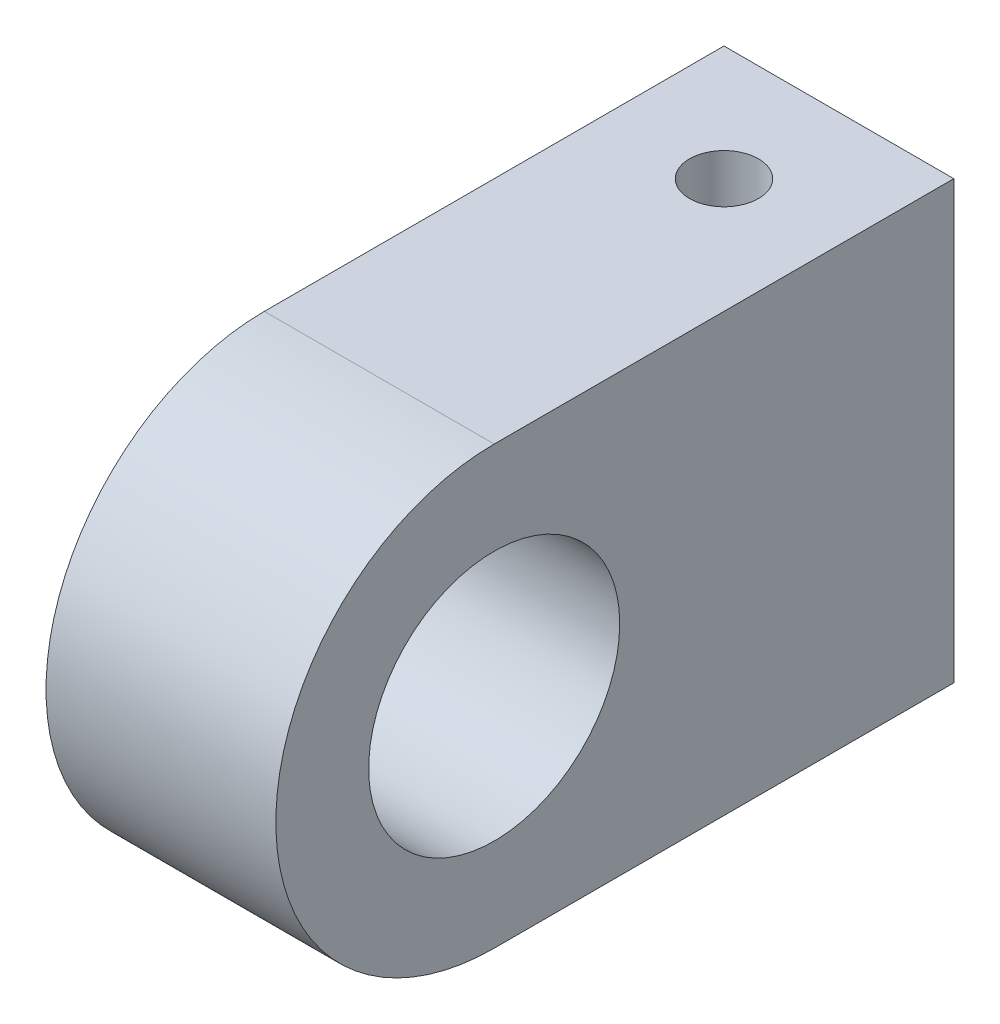
ISO-10303-21;
HEADER;
FILE_DESCRIPTION(('STEP AP214'),'2;1');
FILE_NAME('part.step','',(''),(''),'','','');
FILE_SCHEMA(('AUTOMOTIVE_DESIGN { 1 0 10303 214 1 1 1 1 }'));
ENDSEC;
DATA;
#1=APPLICATION_CONTEXT('core data for automotive mechanical design processes');
#2=APPLICATION_PROTOCOL_DEFINITION('international standard','automotive_design',2000,#1);
#3=PRODUCT_CONTEXT('',#1,'mechanical');
#4=PRODUCT('Part','Part','',(#3));
#5=PRODUCT_RELATED_PRODUCT_CATEGORY('part','',(#4));
#6=PRODUCT_DEFINITION_FORMATION('','',#4);
#7=PRODUCT_DEFINITION_CONTEXT('part definition',#1,'design');
#8=PRODUCT_DEFINITION('design','',#6,#7);
#9=PRODUCT_DEFINITION_SHAPE('','',#8);
#10=(LENGTH_UNIT() NAMED_UNIT(*) SI_UNIT(.MILLI.,.METRE.));
#11=(NAMED_UNIT(*) PLANE_ANGLE_UNIT() SI_UNIT($,.RADIAN.));
#12=(NAMED_UNIT(*) SI_UNIT($,.STERADIAN.) SOLID_ANGLE_UNIT());
#13=UNCERTAINTY_MEASURE_WITH_UNIT(LENGTH_MEASURE(1.E-05),#10,'distance_accuracy_value','');
#14=(GEOMETRIC_REPRESENTATION_CONTEXT(3) GLOBAL_UNCERTAINTY_ASSIGNED_CONTEXT((#13)) GLOBAL_UNIT_ASSIGNED_CONTEXT((#10,
#11,#12)) REPRESENTATION_CONTEXT('',''));
#15=CARTESIAN_POINT('',(0.,0.,0.));
#16=DIRECTION('',(0.,0.,1.));
#17=DIRECTION('',(1.,0.,0.));
#18=AXIS2_PLACEMENT_3D('',#15,#16,#17);
#19=CARTESIAN_POINT('',(10.,0.,0.));
#20=DIRECTION('',(1.,0.,0.));
#21=DIRECTION('',(0.,0.,-1.));
#22=AXIS2_PLACEMENT_3D('',#19,#20,#21);
#23=PLANE('',#22);
#24=CARTESIAN_POINT('',(10.,0.,0.));
#25=DIRECTION('',(1.,0.,0.));
#26=DIRECTION('',(0.,0.,-1.));
#27=AXIS2_PLACEMENT_3D('',#24,#25,#26);
#28=CIRCLE('',#27,9.5);
#29=CARTESIAN_POINT('',(10.,9.5,0.));
#30=VERTEX_POINT('',#29);
#31=CARTESIAN_POINT('',(10.,-9.5,0.));
#32=VERTEX_POINT('',#31);
#33=EDGE_CURVE('E51',#30,#32,#28,.T.);
#34=ORIENTED_EDGE('',*,*,#33,.T.);
#35=DIRECTION('',(0.,0.,-1.));
#36=VECTOR('',#35,1.);
#37=CARTESIAN_POINT('',(10.,-9.5,-20.));
#38=LINE('',#37,#36);
#39=CARTESIAN_POINT('',(10.,-9.5,-20.));
#40=VERTEX_POINT('',#39);
#41=EDGE_CURVE('E82',#32,#40,#38,.T.);
#42=ORIENTED_EDGE('',*,*,#41,.T.);
#43=DIRECTION('',(0.,1.,0.));
#44=VECTOR('',#43,1.);
#45=CARTESIAN_POINT('',(10.,9.5,-20.));
#46=LINE('',#45,#44);
#47=CARTESIAN_POINT('',(10.,9.5,-20.));
#48=VERTEX_POINT('',#47);
#49=EDGE_CURVE('E86',#40,#48,#46,.T.);
#50=ORIENTED_EDGE('',*,*,#49,.T.);
#51=DIRECTION('',(0.,0.,1.));
#52=VECTOR('',#51,1.);
#53=CARTESIAN_POINT('',(10.,9.5,0.));
#54=LINE('',#53,#52);
#55=EDGE_CURVE('E93',#48,#30,#54,.T.);
#56=ORIENTED_EDGE('',*,*,#55,.T.);
#57=EDGE_LOOP('',(#34,#42,#50,#56));
#58=FACE_BOUND('',#57,.T.);
#59=CARTESIAN_POINT('',(10.,0.,0.));
#60=DIRECTION('',(1.,0.,0.));
#61=DIRECTION('',(0.,0.,-1.));
#62=AXIS2_PLACEMENT_3D('',#59,#60,#61);
#63=CIRCLE('',#62,5.46283639494344);
#64=CARTESIAN_POINT('',(10.,0.,-5.46283639494344));
#65=VERTEX_POINT('',#64);
#66=EDGE_CURVE('E100',#65,#65,#63,.T.);
#67=ORIENTED_EDGE('',*,*,#66,.F.);
#68=EDGE_LOOP('',(#67));
#69=FACE_BOUND('',#68,.T.);
#70=ADVANCED_FACE('F34',(#58,#69),#23,.T.);
#71=CARTESIAN_POINT('',(0.,0.,0.));
#72=DIRECTION('',(1.,0.,0.));
#73=DIRECTION('',(0.,0.,-1.));
#74=AXIS2_PLACEMENT_3D('',#71,#72,#73);
#75=PLANE('',#74);
#76=DIRECTION('',(0.,0.,-1.));
#77=VECTOR('',#76,1.);
#78=CARTESIAN_POINT('',(0.,-9.5,-20.));
#79=LINE('',#78,#77);
#80=CARTESIAN_POINT('',(0.,-9.5,0.));
#81=VERTEX_POINT('',#80);
#82=CARTESIAN_POINT('',(0.,-9.5,-20.));
#83=VERTEX_POINT('',#82);
#84=EDGE_CURVE('E89',#81,#83,#79,.T.);
#85=ORIENTED_EDGE('',*,*,#84,.F.);
#86=CARTESIAN_POINT('',(0.,0.,0.));
#87=DIRECTION('',(1.,0.,0.));
#88=DIRECTION('',(0.,0.,1.));
#89=AXIS2_PLACEMENT_3D('',#86,#87,#88);
#90=CIRCLE('',#89,9.5);
#91=CARTESIAN_POINT('',(0.,9.5,0.));
#92=VERTEX_POINT('',#91);
#93=EDGE_CURVE('E103',#92,#81,#90,.T.);
#94=ORIENTED_EDGE('',*,*,#93,.F.);
#95=DIRECTION('',(0.,0.,1.));
#96=VECTOR('',#95,1.);
#97=CARTESIAN_POINT('',(0.,9.5,0.));
#98=LINE('',#97,#96);
#99=CARTESIAN_POINT('',(0.,9.5,-20.));
#100=VERTEX_POINT('',#99);
#101=EDGE_CURVE('E76',#100,#92,#98,.T.);
#102=ORIENTED_EDGE('',*,*,#101,.F.);
#103=DIRECTION('',(0.,1.,0.));
#104=VECTOR('',#103,1.);
#105=CARTESIAN_POINT('',(0.,9.5,-20.));
#106=LINE('',#105,#104);
#107=EDGE_CURVE('E69',#83,#100,#106,.T.);
#108=ORIENTED_EDGE('',*,*,#107,.F.);
#109=EDGE_LOOP('',(#85,#94,#102,#108));
#110=FACE_BOUND('',#109,.T.);
#111=CARTESIAN_POINT('',(0.,0.,0.));
#112=DIRECTION('',(1.,0.,0.));
#113=DIRECTION('',(0.,0.,-1.));
#114=AXIS2_PLACEMENT_3D('',#111,#112,#113);
#115=CIRCLE('',#114,5.46283639494344);
#116=CARTESIAN_POINT('',(0.,0.,-5.46283639494344));
#117=VERTEX_POINT('',#116);
#118=EDGE_CURVE('E143',#117,#117,#115,.T.);
#119=ORIENTED_EDGE('',*,*,#118,.T.);
#120=EDGE_LOOP('',(#119));
#121=FACE_BOUND('',#120,.T.);
#122=ADVANCED_FACE('F109',(#110,#121),#75,.F.);
#123=CARTESIAN_POINT('',(10.,-9.5,-20.));
#124=DIRECTION('',(0.,1.,0.));
#125=DIRECTION('',(0.,0.,1.));
#126=AXIS2_PLACEMENT_3D('',#123,#124,#125);
#127=PLANE('',#126);
#128=CARTESIAN_POINT('',(5.,-9.5,-15.));
#129=DIRECTION('',(0.,1.,0.));
#130=DIRECTION('',(0.,0.,1.));
#131=AXIS2_PLACEMENT_3D('',#128,#129,#130);
#132=CIRCLE('',#131,1.5);
#133=CARTESIAN_POINT('',(5.,-9.5,-13.5));
#134=VERTEX_POINT('',#133);
#135=EDGE_CURVE('E138',#134,#134,#132,.T.);
#136=ORIENTED_EDGE('',*,*,#135,.T.);
#137=EDGE_LOOP('',(#136));
#138=FACE_BOUND('',#137,.T.);
#139=ORIENTED_EDGE('',*,*,#84,.T.);
#140=DIRECTION('',(-1.,0.,0.));
#141=VECTOR('',#140,1.);
#142=CARTESIAN_POINT('',(10.,-9.5,-20.));
#143=LINE('',#142,#141);
#144=EDGE_CURVE('E43',#40,#83,#143,.T.);
#145=ORIENTED_EDGE('',*,*,#144,.F.);
#146=ORIENTED_EDGE('',*,*,#41,.F.);
#147=DIRECTION('',(-1.,0.,0.));
#148=VECTOR('',#147,1.);
#149=CARTESIAN_POINT('',(10.,-9.5,0.));
#150=LINE('',#149,#148);
#151=EDGE_CURVE('E11',#32,#81,#150,.T.);
#152=ORIENTED_EDGE('',*,*,#151,.T.);
#153=EDGE_LOOP('',(#139,#145,#146,#152));
#154=FACE_BOUND('',#153,.T.);
#155=ADVANCED_FACE('F36',(#138,#154),#127,.F.);
#156=CARTESIAN_POINT('',(10.,9.5,-20.));
#157=DIRECTION('',(0.,0.,1.));
#158=DIRECTION('',(0.,-1.,0.));
#159=AXIS2_PLACEMENT_3D('',#156,#157,#158);
#160=PLANE('',#159);
#161=ORIENTED_EDGE('',*,*,#107,.T.);
#162=DIRECTION('',(-1.,0.,0.));
#163=VECTOR('',#162,1.);
#164=CARTESIAN_POINT('',(10.,9.5,-20.));
#165=LINE('',#164,#163);
#166=EDGE_CURVE('E90',#48,#100,#165,.T.);
#167=ORIENTED_EDGE('',*,*,#166,.F.);
#168=ORIENTED_EDGE('',*,*,#49,.F.);
#169=ORIENTED_EDGE('',*,*,#144,.T.);
#170=EDGE_LOOP('',(#161,#167,#168,#169));
#171=FACE_BOUND('',#170,.T.);
#172=ADVANCED_FACE('F91',(#171),#160,.F.);
#173=CARTESIAN_POINT('',(10.,9.5,0.));
#174=DIRECTION('',(0.,-1.,0.));
#175=DIRECTION('',(0.,0.,-1.));
#176=AXIS2_PLACEMENT_3D('',#173,#174,#175);
#177=PLANE('',#176);
#178=CARTESIAN_POINT('',(5.,9.5,-15.));
#179=DIRECTION('',(0.,1.,0.));
#180=DIRECTION('',(0.,0.,1.));
#181=AXIS2_PLACEMENT_3D('',#178,#179,#180);
#182=CIRCLE('',#181,1.5);
#183=CARTESIAN_POINT('',(5.,9.5,-13.5));
#184=VERTEX_POINT('',#183);
#185=EDGE_CURVE('E141',#184,#184,#182,.T.);
#186=ORIENTED_EDGE('',*,*,#185,.F.);
#187=EDGE_LOOP('',(#186));
#188=FACE_BOUND('',#187,.T.);
#189=ORIENTED_EDGE('',*,*,#101,.T.);
#190=DIRECTION('',(-1.,0.,0.));
#191=VECTOR('',#190,1.);
#192=CARTESIAN_POINT('',(10.,9.5,0.));
#193=LINE('',#192,#191);
#194=EDGE_CURVE('E95',#30,#92,#193,.T.);
#195=ORIENTED_EDGE('',*,*,#194,.F.);
#196=ORIENTED_EDGE('',*,*,#55,.F.);
#197=ORIENTED_EDGE('',*,*,#166,.T.);
#198=EDGE_LOOP('',(#189,#195,#196,#197));
#199=FACE_BOUND('',#198,.T.);
#200=ADVANCED_FACE('F106',(#188,#199),#177,.F.);
#201=CARTESIAN_POINT('',(10.,0.,0.));
#202=DIRECTION('',(-1.,0.,0.));
#203=DIRECTION('',(0.,0.,1.));
#204=AXIS2_PLACEMENT_3D('',#201,#202,#203);
#205=CYLINDRICAL_SURFACE('',#204,9.5);
#206=ORIENTED_EDGE('',*,*,#93,.T.);
#207=ORIENTED_EDGE('',*,*,#151,.F.);
#208=ORIENTED_EDGE('',*,*,#33,.F.);
#209=ORIENTED_EDGE('',*,*,#194,.T.);
#210=EDGE_LOOP('',(#206,#207,#208,#209));
#211=FACE_BOUND('',#210,.T.);
#212=ADVANCED_FACE('F111',(#211),#205,.T.);
#213=CARTESIAN_POINT('',(10.,0.,0.));
#214=DIRECTION('',(-1.,0.,0.));
#215=DIRECTION('',(0.,0.,1.));
#216=AXIS2_PLACEMENT_3D('',#213,#214,#215);
#217=CYLINDRICAL_SURFACE('',#216,5.46283639494344);
#218=ORIENTED_EDGE('',*,*,#66,.T.);
#219=EDGE_LOOP('',(#218));
#220=FACE_BOUND('',#219,.T.);
#221=ORIENTED_EDGE('',*,*,#118,.F.);
#222=EDGE_LOOP('',(#221));
#223=FACE_BOUND('',#222,.T.);
#224=ADVANCED_FACE('F113',(#220,#223),#217,.F.);
#225=CARTESIAN_POINT('',(5.,-9.5,-15.));
#226=DIRECTION('',(0.,1.,0.));
#227=DIRECTION('',(0.,0.,1.));
#228=AXIS2_PLACEMENT_3D('',#225,#226,#227);
#229=CYLINDRICAL_SURFACE('',#228,1.5);
#230=ORIENTED_EDGE('',*,*,#135,.F.);
#231=EDGE_LOOP('',(#230));
#232=FACE_BOUND('',#231,.T.);
#233=ORIENTED_EDGE('',*,*,#185,.T.);
#234=EDGE_LOOP('',(#233));
#235=FACE_BOUND('',#234,.T.);
#236=ADVANCED_FACE('F119',(#232,#235),#229,.F.);
#237=CLOSED_SHELL('',(#70,#122,#155,#172,#200,#212,#224,#236));
#238=MANIFOLD_SOLID_BREP('B2',#237);
#239=ADVANCED_BREP_SHAPE_REPRESENTATION('',(#18,#238),#14);
#240=SHAPE_DEFINITION_REPRESENTATION(#9,#239);
ENDSEC;
END-ISO-10303-21;
